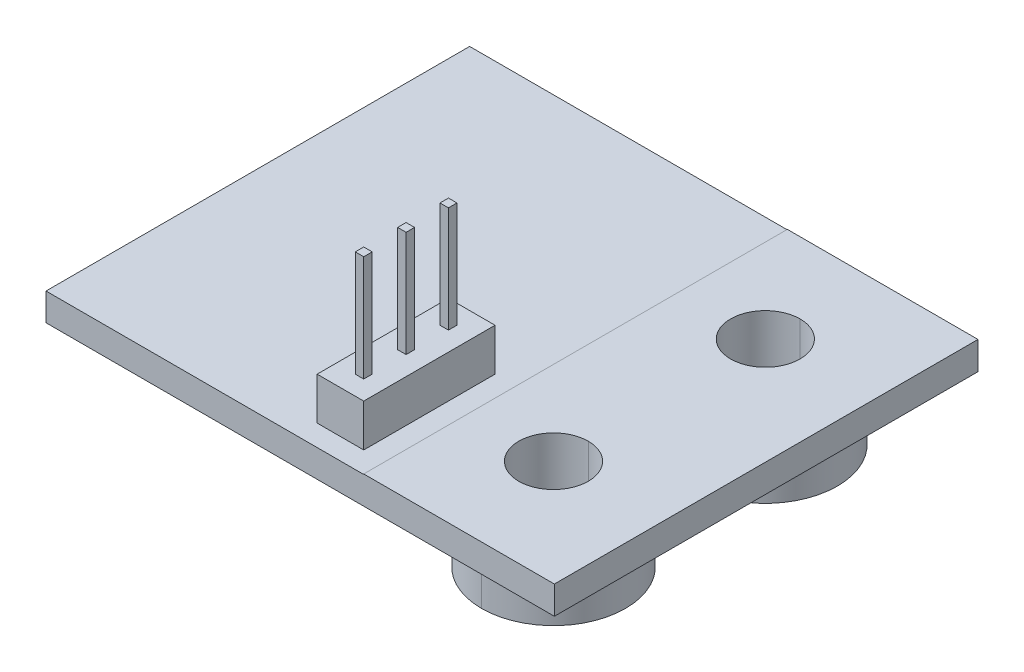
ISO-10303-21;
HEADER;
FILE_DESCRIPTION(('STEP AP214'),'2;1');
FILE_NAME('part.step','',(''),(''),'','','');
FILE_SCHEMA(('AUTOMOTIVE_DESIGN { 1 0 10303 214 1 1 1 1 }'));
ENDSEC;
DATA;
#1=APPLICATION_CONTEXT('core data for automotive mechanical design processes');
#2=APPLICATION_PROTOCOL_DEFINITION('international standard','automotive_design',2000,#1);
#3=PRODUCT_CONTEXT('',#1,'mechanical');
#4=PRODUCT('Part','Part','',(#3));
#5=PRODUCT_RELATED_PRODUCT_CATEGORY('part','',(#4));
#6=PRODUCT_DEFINITION_FORMATION('','',#4);
#7=PRODUCT_DEFINITION_CONTEXT('part definition',#1,'design');
#8=PRODUCT_DEFINITION('design','',#6,#7);
#9=PRODUCT_DEFINITION_SHAPE('','',#8);
#10=(LENGTH_UNIT() NAMED_UNIT(*) SI_UNIT(.MILLI.,.METRE.));
#11=(NAMED_UNIT(*) PLANE_ANGLE_UNIT() SI_UNIT($,.RADIAN.));
#12=(NAMED_UNIT(*) SI_UNIT($,.STERADIAN.) SOLID_ANGLE_UNIT());
#13=UNCERTAINTY_MEASURE_WITH_UNIT(LENGTH_MEASURE(1.E-05),#10,'distance_accuracy_value','');
#14=(GEOMETRIC_REPRESENTATION_CONTEXT(3) GLOBAL_UNCERTAINTY_ASSIGNED_CONTEXT((#13)) GLOBAL_UNIT_ASSIGNED_CONTEXT((#10,
#11,#12)) REPRESENTATION_CONTEXT('',''));
#15=CARTESIAN_POINT('',(0.,0.,0.));
#16=DIRECTION('',(0.,0.,1.));
#17=DIRECTION('',(1.,0.,0.));
#18=AXIS2_PLACEMENT_3D('',#15,#16,#17);
#19=CARTESIAN_POINT('',(8.8392,-4.6355,-6.35));
#20=DIRECTION('',(0.,1.,0.));
#21=DIRECTION('',(0.,0.,1.));
#22=AXIS2_PLACEMENT_3D('',#19,#20,#21);
#23=CYLINDRICAL_SURFACE('',#22,4.318);
#24=CARTESIAN_POINT('',(8.8392,-4.6355,-6.35));
#25=DIRECTION('',(0.,-1.,0.));
#26=DIRECTION('',(0.,0.,-1.));
#27=AXIS2_PLACEMENT_3D('',#24,#25,#26);
#28=CIRCLE('',#27,4.318);
#29=CARTESIAN_POINT('',(8.8392,-4.6355,-10.668));
#30=VERTEX_POINT('',#29);
#31=CARTESIAN_POINT('',(8.8392,-4.6355,-2.032));
#32=VERTEX_POINT('',#31);
#33=EDGE_CURVE('E41',#30,#32,#28,.T.);
#34=ORIENTED_EDGE('',*,*,#33,.F.);
#35=DIRECTION('',(0.,1.,0.));
#36=VECTOR('',#35,1.);
#37=CARTESIAN_POINT('',(8.8392,-4.6355,-10.668));
#38=LINE('',#37,#36);
#39=CARTESIAN_POINT('',(8.8392,-0.8255,-10.668));
#40=VERTEX_POINT('',#39);
#41=EDGE_CURVE('E10',#30,#40,#38,.T.);
#42=ORIENTED_EDGE('',*,*,#41,.T.);
#43=CARTESIAN_POINT('',(8.8392,-0.8255,-6.35));
#44=DIRECTION('',(0.,-1.,0.));
#45=DIRECTION('',(0.,0.,-1.));
#46=AXIS2_PLACEMENT_3D('',#43,#44,#45);
#47=CIRCLE('',#46,4.318);
#48=CARTESIAN_POINT('',(8.8392,-0.8255,-2.032));
#49=VERTEX_POINT('',#48);
#50=EDGE_CURVE('E30',#40,#49,#47,.T.);
#51=ORIENTED_EDGE('',*,*,#50,.T.);
#52=DIRECTION('',(0.,1.,0.));
#53=VECTOR('',#52,1.);
#54=CARTESIAN_POINT('',(8.8392,-4.6355,-2.032));
#55=LINE('',#54,#53);
#56=EDGE_CURVE('E388',#32,#49,#55,.T.);
#57=ORIENTED_EDGE('',*,*,#56,.F.);
#58=EDGE_LOOP('',(#34,#42,#51,#57));
#59=FACE_BOUND('',#58,.T.);
#60=ADVANCED_FACE('F16',(#59),#23,.T.);
#61=CARTESIAN_POINT('',(8.8392,-4.6355,6.35));
#62=DIRECTION('',(0.,1.,0.));
#63=DIRECTION('',(0.,0.,1.));
#64=AXIS2_PLACEMENT_3D('',#61,#62,#63);
#65=CYLINDRICAL_SURFACE('',#64,4.318);
#66=CARTESIAN_POINT('',(8.8392,-4.6355,6.35));
#67=DIRECTION('',(0.,-1.,0.));
#68=DIRECTION('',(0.,0.,-1.));
#69=AXIS2_PLACEMENT_3D('',#66,#67,#68);
#70=CIRCLE('',#69,4.318);
#71=CARTESIAN_POINT('',(8.8392,-4.6355,2.032));
#72=VERTEX_POINT('',#71);
#73=CARTESIAN_POINT('',(8.8392,-4.6355,10.668));
#74=VERTEX_POINT('',#73);
#75=EDGE_CURVE('E535',#72,#74,#70,.T.);
#76=ORIENTED_EDGE('',*,*,#75,.F.);
#77=DIRECTION('',(0.,1.,0.));
#78=VECTOR('',#77,1.);
#79=CARTESIAN_POINT('',(8.8392,-4.6355,2.032));
#80=LINE('',#79,#78);
#81=CARTESIAN_POINT('',(8.8392,-0.8255,2.032));
#82=VERTEX_POINT('',#81);
#83=EDGE_CURVE('E299',#72,#82,#80,.T.);
#84=ORIENTED_EDGE('',*,*,#83,.T.);
#85=CARTESIAN_POINT('',(8.8392,-0.8255,6.35));
#86=DIRECTION('',(0.,-1.,0.));
#87=DIRECTION('',(0.,0.,-1.));
#88=AXIS2_PLACEMENT_3D('',#85,#86,#87);
#89=CIRCLE('',#88,4.318);
#90=CARTESIAN_POINT('',(8.8392,-0.8255,10.668));
#91=VERTEX_POINT('',#90);
#92=EDGE_CURVE('E444',#82,#91,#89,.T.);
#93=ORIENTED_EDGE('',*,*,#92,.T.);
#94=DIRECTION('',(0.,1.,0.));
#95=VECTOR('',#94,1.);
#96=CARTESIAN_POINT('',(8.8392,-4.6355,10.668));
#97=LINE('',#96,#95);
#98=EDGE_CURVE('E476',#74,#91,#97,.T.);
#99=ORIENTED_EDGE('',*,*,#98,.F.);
#100=EDGE_LOOP('',(#76,#84,#93,#99));
#101=FACE_BOUND('',#100,.T.);
#102=ADVANCED_FACE('F663',(#101),#65,.T.);
#103=CARTESIAN_POINT('',(8.8392,0.8255,6.35));
#104=DIRECTION('',(0.,-1.,0.));
#105=DIRECTION('',(0.,0.,-1.));
#106=AXIS2_PLACEMENT_3D('',#103,#104,#105);
#107=CYLINDRICAL_SURFACE('',#106,2.0828);
#108=CARTESIAN_POINT('',(8.8392,0.8509,6.35));
#109=DIRECTION('',(0.,1.,0.));
#110=DIRECTION('',(0.,0.,1.));
#111=AXIS2_PLACEMENT_3D('',#108,#109,#110);
#112=CIRCLE('',#111,2.0828);
#113=CARTESIAN_POINT('',(8.8392,0.8509,4.2672));
#114=VERTEX_POINT('',#113);
#115=CARTESIAN_POINT('',(8.8392,0.8509,8.4328));
#116=VERTEX_POINT('',#115);
#117=EDGE_CURVE('E451',#114,#116,#112,.T.);
#118=ORIENTED_EDGE('',*,*,#117,.T.);
#119=DIRECTION('',(0.,-1.,0.));
#120=VECTOR('',#119,1.);
#121=CARTESIAN_POINT('',(8.8392,0.8255,8.4328));
#122=LINE('',#121,#120);
#123=CARTESIAN_POINT('',(8.8392,-4.6355,8.4328));
#124=VERTEX_POINT('',#123);
#125=EDGE_CURVE('E447',#116,#124,#122,.T.);
#126=ORIENTED_EDGE('',*,*,#125,.T.);
#127=CARTESIAN_POINT('',(8.8392,-4.6355,6.35));
#128=DIRECTION('',(0.,-1.,0.));
#129=DIRECTION('',(0.,0.,-1.));
#130=AXIS2_PLACEMENT_3D('',#127,#128,#129);
#131=CIRCLE('',#130,2.0828);
#132=CARTESIAN_POINT('',(8.8392,-4.6355,4.2672));
#133=VERTEX_POINT('',#132);
#134=EDGE_CURVE('E308',#124,#133,#131,.T.);
#135=ORIENTED_EDGE('',*,*,#134,.T.);
#136=DIRECTION('',(0.,-1.,0.));
#137=VECTOR('',#136,1.);
#138=CARTESIAN_POINT('',(8.8392,0.8255,4.2672));
#139=LINE('',#138,#137);
#140=EDGE_CURVE('E359',#114,#133,#139,.T.);
#141=ORIENTED_EDGE('',*,*,#140,.F.);
#142=EDGE_LOOP('',(#118,#126,#135,#141));
#143=FACE_BOUND('',#142,.T.);
#144=ADVANCED_FACE('F648',(#143),#107,.F.);
#145=CARTESIAN_POINT('',(8.8392,0.8255,-6.35));
#146=DIRECTION('',(0.,-1.,0.));
#147=DIRECTION('',(0.,0.,-1.));
#148=AXIS2_PLACEMENT_3D('',#145,#146,#147);
#149=CYLINDRICAL_SURFACE('',#148,2.0828);
#150=CARTESIAN_POINT('',(8.8392,0.8509,-6.35));
#151=DIRECTION('',(0.,1.,0.));
#152=DIRECTION('',(0.,0.,1.));
#153=AXIS2_PLACEMENT_3D('',#150,#151,#152);
#154=CIRCLE('',#153,2.0828);
#155=CARTESIAN_POINT('',(8.8392,0.8509,-8.4328));
#156=VERTEX_POINT('',#155);
#157=CARTESIAN_POINT('',(8.8392,0.8509,-4.2672));
#158=VERTEX_POINT('',#157);
#159=EDGE_CURVE('E305',#156,#158,#154,.T.);
#160=ORIENTED_EDGE('',*,*,#159,.T.);
#161=DIRECTION('',(0.,-1.,0.));
#162=VECTOR('',#161,1.);
#163=CARTESIAN_POINT('',(8.8392,0.8255,-4.2672));
#164=LINE('',#163,#162);
#165=CARTESIAN_POINT('',(8.8392,-4.6355,-4.2672));
#166=VERTEX_POINT('',#165);
#167=EDGE_CURVE('E307',#158,#166,#164,.T.);
#168=ORIENTED_EDGE('',*,*,#167,.T.);
#169=CARTESIAN_POINT('',(8.8392,-4.6355,-6.35));
#170=DIRECTION('',(0.,-1.,0.));
#171=DIRECTION('',(0.,0.,-1.));
#172=AXIS2_PLACEMENT_3D('',#169,#170,#171);
#173=CIRCLE('',#172,2.0828);
#174=CARTESIAN_POINT('',(8.8392,-4.6355,-8.4328));
#175=VERTEX_POINT('',#174);
#176=EDGE_CURVE('E366',#166,#175,#173,.T.);
#177=ORIENTED_EDGE('',*,*,#176,.T.);
#178=DIRECTION('',(0.,-1.,0.));
#179=VECTOR('',#178,1.);
#180=CARTESIAN_POINT('',(8.8392,0.8255,-8.4328));
#181=LINE('',#180,#179);
#182=EDGE_CURVE('E354',#156,#175,#181,.T.);
#183=ORIENTED_EDGE('',*,*,#182,.F.);
#184=EDGE_LOOP('',(#160,#168,#177,#183));
#185=FACE_BOUND('',#184,.T.);
#186=ADVANCED_FACE('F634',(#185),#149,.F.);
#187=CARTESIAN_POINT('',(15.24,0.8255,-12.7));
#188=DIRECTION('',(0.,-1.,0.));
#189=DIRECTION('',(0.,0.,-1.));
#190=AXIS2_PLACEMENT_3D('',#187,#188,#189);
#191=PLANE('',#190);
#192=DIRECTION('',(0.,0.,1.));
#193=VECTOR('',#192,1.);
#194=CARTESIAN_POINT('',(3.81,0.8255,-12.7));
#195=LINE('',#194,#193);
#196=CARTESIAN_POINT('',(3.81,0.8255,-12.7));
#197=VERTEX_POINT('',#196);
#198=CARTESIAN_POINT('',(3.81,0.8255,12.7));
#199=VERTEX_POINT('',#198);
#200=EDGE_CURVE('E247',#197,#199,#195,.T.);
#201=ORIENTED_EDGE('',*,*,#200,.F.);
#202=DIRECTION('',(-1.,0.,0.));
#203=VECTOR('',#202,1.);
#204=CARTESIAN_POINT('',(-15.24,0.8255,-12.7));
#205=LINE('',#204,#203);
#206=CARTESIAN_POINT('',(-15.24,0.8255,-12.7));
#207=VERTEX_POINT('',#206);
#208=EDGE_CURVE('E244',#197,#207,#205,.T.);
#209=ORIENTED_EDGE('',*,*,#208,.T.);
#210=DIRECTION('',(0.,0.,1.));
#211=VECTOR('',#210,1.);
#212=CARTESIAN_POINT('',(-15.24,0.8255,12.7));
#213=LINE('',#212,#211);
#214=CARTESIAN_POINT('',(-15.24,0.8255,12.7));
#215=VERTEX_POINT('',#214);
#216=EDGE_CURVE('E406',#207,#215,#213,.T.);
#217=ORIENTED_EDGE('',*,*,#216,.T.);
#218=DIRECTION('',(1.,0.,0.));
#219=VECTOR('',#218,1.);
#220=CARTESIAN_POINT('',(-15.24,0.8255,12.7));
#221=LINE('',#220,#219);
#222=EDGE_CURVE('E409',#215,#199,#221,.T.);
#223=ORIENTED_EDGE('',*,*,#222,.T.);
#224=EDGE_LOOP('',(#201,#209,#217,#223));
#225=FACE_BOUND('',#224,.T.);
#226=DIRECTION('',(0.,0.,1.));
#227=VECTOR('',#226,1.);
#228=CARTESIAN_POINT('',(-0.254,0.8255,3.556));
#229=LINE('',#228,#227);
#230=CARTESIAN_POINT('',(-0.254,0.8255,3.556));
#231=VERTEX_POINT('',#230);
#232=CARTESIAN_POINT('',(-0.254,0.8255,11.43));
#233=VERTEX_POINT('',#232);
#234=EDGE_CURVE('E322',#231,#233,#229,.T.);
#235=ORIENTED_EDGE('',*,*,#234,.F.);
#236=DIRECTION('',(-1.,0.,0.));
#237=VECTOR('',#236,1.);
#238=CARTESIAN_POINT('',(-0.254,0.8255,3.556));
#239=LINE('',#238,#237);
#240=CARTESIAN_POINT('',(2.54,0.8255,3.556));
#241=VERTEX_POINT('',#240);
#242=EDGE_CURVE('E568',#241,#231,#239,.T.);
#243=ORIENTED_EDGE('',*,*,#242,.F.);
#244=DIRECTION('',(0.,0.,-1.));
#245=VECTOR('',#244,1.);
#246=CARTESIAN_POINT('',(2.54,0.8255,3.556));
#247=LINE('',#246,#245);
#248=CARTESIAN_POINT('',(2.54,0.8255,11.43));
#249=VERTEX_POINT('',#248);
#250=EDGE_CURVE('E482',#249,#241,#247,.T.);
#251=ORIENTED_EDGE('',*,*,#250,.F.);
#252=DIRECTION('',(1.,0.,0.));
#253=VECTOR('',#252,1.);
#254=CARTESIAN_POINT('',(-0.254,0.8255,11.43));
#255=LINE('',#254,#253);
#256=EDGE_CURVE('E324',#233,#249,#255,.T.);
#257=ORIENTED_EDGE('',*,*,#256,.F.);
#258=EDGE_LOOP('',(#235,#243,#251,#257));
#259=FACE_BOUND('',#258,.T.);
#260=ADVANCED_FACE('F605',(#225,#259),#191,.F.);
#261=CARTESIAN_POINT('',(-0.254,3.3655,11.43));
#262=DIRECTION('',(0.,1.,0.));
#263=DIRECTION('',(1.,0.,0.));
#264=AXIS2_PLACEMENT_3D('',#261,#262,#263);
#265=PLANE('',#264);
#266=DIRECTION('',(0.,0.,1.));
#267=VECTOR('',#266,1.);
#268=CARTESIAN_POINT('',(-0.254,3.3655,3.556));
#269=LINE('',#268,#267);
#270=CARTESIAN_POINT('',(-0.254,3.3655,3.556));
#271=VERTEX_POINT('',#270);
#272=CARTESIAN_POINT('',(-0.254,3.3655,11.43));
#273=VERTEX_POINT('',#272);
#274=EDGE_CURVE('E429',#271,#273,#269,.T.);
#275=ORIENTED_EDGE('',*,*,#274,.T.);
#276=DIRECTION('',(1.,0.,0.));
#277=VECTOR('',#276,1.);
#278=CARTESIAN_POINT('',(-0.254,3.3655,11.43));
#279=LINE('',#278,#277);
#280=CARTESIAN_POINT('',(2.54,3.3655,11.43));
#281=VERTEX_POINT('',#280);
#282=EDGE_CURVE('E417',#273,#281,#279,.T.);
#283=ORIENTED_EDGE('',*,*,#282,.T.);
#284=DIRECTION('',(0.,0.,-1.));
#285=VECTOR('',#284,1.);
#286=CARTESIAN_POINT('',(2.54,3.3655,3.556));
#287=LINE('',#286,#285);
#288=CARTESIAN_POINT('',(2.54,3.3655,3.556));
#289=VERTEX_POINT('',#288);
#290=EDGE_CURVE('E412',#281,#289,#287,.T.);
#291=ORIENTED_EDGE('',*,*,#290,.T.);
#292=DIRECTION('',(-1.,0.,0.));
#293=VECTOR('',#292,1.);
#294=CARTESIAN_POINT('',(-0.254,3.3655,3.556));
#295=LINE('',#294,#293);
#296=EDGE_CURVE('E405',#289,#271,#295,.T.);
#297=ORIENTED_EDGE('',*,*,#296,.T.);
#298=EDGE_LOOP('',(#275,#283,#291,#297));
#299=FACE_BOUND('',#298,.T.);
#300=DIRECTION('',(-1.,0.,0.));
#301=VECTOR('',#300,1.);
#302=CARTESIAN_POINT('',(0.889,3.3655,9.779));
#303=LINE('',#302,#301);
#304=CARTESIAN_POINT('',(1.397,3.3655,9.779));
#305=VERTEX_POINT('',#304);
#306=CARTESIAN_POINT('',(0.889,3.3655,9.779));
#307=VERTEX_POINT('',#306);
#308=EDGE_CURVE('E333',#305,#307,#303,.T.);
#309=ORIENTED_EDGE('',*,*,#308,.F.);
#310=DIRECTION('',(0.,0.,-1.));
#311=VECTOR('',#310,1.);
#312=CARTESIAN_POINT('',(1.397,3.3655,10.287));
#313=LINE('',#312,#311);
#314=CARTESIAN_POINT('',(1.397,3.3655,10.287));
#315=VERTEX_POINT('',#314);
#316=EDGE_CURVE('E454',#315,#305,#313,.T.);
#317=ORIENTED_EDGE('',*,*,#316,.F.);
#318=DIRECTION('',(1.,0.,0.));
#319=VECTOR('',#318,1.);
#320=CARTESIAN_POINT('',(0.889,3.3655,10.287));
#321=LINE('',#320,#319);
#322=CARTESIAN_POINT('',(0.889,3.3655,10.287));
#323=VERTEX_POINT('',#322);
#324=EDGE_CURVE('E344',#323,#315,#321,.T.);
#325=ORIENTED_EDGE('',*,*,#324,.F.);
#326=DIRECTION('',(0.,0.,1.));
#327=VECTOR('',#326,1.);
#328=CARTESIAN_POINT('',(0.889,3.3655,10.287));
#329=LINE('',#328,#327);
#330=EDGE_CURVE('E375',#307,#323,#329,.T.);
#331=ORIENTED_EDGE('',*,*,#330,.F.);
#332=EDGE_LOOP('',(#309,#317,#325,#331));
#333=FACE_BOUND('',#332,.T.);
#334=DIRECTION('',(-1.,0.,0.));
#335=VECTOR('',#334,1.);
#336=CARTESIAN_POINT('',(0.889,3.3655,7.239));
#337=LINE('',#336,#335);
#338=CARTESIAN_POINT('',(1.397,3.3655,7.239));
#339=VERTEX_POINT('',#338);
#340=CARTESIAN_POINT('',(0.889,3.3655,7.239));
#341=VERTEX_POINT('',#340);
#342=EDGE_CURVE('E496',#339,#341,#337,.T.);
#343=ORIENTED_EDGE('',*,*,#342,.F.);
#344=DIRECTION('',(0.,0.,-1.));
#345=VECTOR('',#344,1.);
#346=CARTESIAN_POINT('',(1.397,3.3655,7.747));
#347=LINE('',#346,#345);
#348=CARTESIAN_POINT('',(1.397,3.3655,7.747));
#349=VERTEX_POINT('',#348);
#350=EDGE_CURVE('E291',#349,#339,#347,.T.);
#351=ORIENTED_EDGE('',*,*,#350,.F.);
#352=DIRECTION('',(1.,0.,0.));
#353=VECTOR('',#352,1.);
#354=CARTESIAN_POINT('',(0.889,3.3655,7.747));
#355=LINE('',#354,#353);
#356=CARTESIAN_POINT('',(0.889,3.3655,7.747));
#357=VERTEX_POINT('',#356);
#358=EDGE_CURVE('E20',#357,#349,#355,.T.);
#359=ORIENTED_EDGE('',*,*,#358,.F.);
#360=DIRECTION('',(0.,0.,1.));
#361=VECTOR('',#360,1.);
#362=CARTESIAN_POINT('',(0.889,3.3655,7.747));
#363=LINE('',#362,#361);
#364=EDGE_CURVE('E285',#341,#357,#363,.T.);
#365=ORIENTED_EDGE('',*,*,#364,.F.);
#366=EDGE_LOOP('',(#343,#351,#359,#365));
#367=FACE_BOUND('',#366,.T.);
#368=DIRECTION('',(-1.,0.,0.));
#369=VECTOR('',#368,1.);
#370=CARTESIAN_POINT('',(0.889,3.3655,4.699));
#371=LINE('',#370,#369);
#372=CARTESIAN_POINT('',(1.397,3.3655,4.699));
#373=VERTEX_POINT('',#372);
#374=CARTESIAN_POINT('',(0.889,3.3655,4.699));
#375=VERTEX_POINT('',#374);
#376=EDGE_CURVE('E329',#373,#375,#371,.T.);
#377=ORIENTED_EDGE('',*,*,#376,.F.);
#378=DIRECTION('',(0.,0.,-1.));
#379=VECTOR('',#378,1.);
#380=CARTESIAN_POINT('',(1.397,3.3655,5.207));
#381=LINE('',#380,#379);
#382=CARTESIAN_POINT('',(1.397,3.3655,5.207));
#383=VERTEX_POINT('',#382);
#384=EDGE_CURVE('E317',#383,#373,#381,.T.);
#385=ORIENTED_EDGE('',*,*,#384,.F.);
#386=DIRECTION('',(1.,0.,0.));
#387=VECTOR('',#386,1.);
#388=CARTESIAN_POINT('',(0.889,3.3655,5.207));
#389=LINE('',#388,#387);
#390=CARTESIAN_POINT('',(0.889,3.3655,5.207));
#391=VERTEX_POINT('',#390);
#392=EDGE_CURVE('E289',#391,#383,#389,.T.);
#393=ORIENTED_EDGE('',*,*,#392,.F.);
#394=DIRECTION('',(0.,0.,1.));
#395=VECTOR('',#394,1.);
#396=CARTESIAN_POINT('',(0.889,3.3655,5.207));
#397=LINE('',#396,#395);
#398=EDGE_CURVE('E346',#375,#391,#397,.T.);
#399=ORIENTED_EDGE('',*,*,#398,.F.);
#400=EDGE_LOOP('',(#377,#385,#393,#399));
#401=FACE_BOUND('',#400,.T.);
#402=ADVANCED_FACE('F697',(#299,#333,#367,#401),#265,.T.);
#403=CARTESIAN_POINT('',(15.24,-0.8255,-12.7));
#404=DIRECTION('',(0.,-1.,0.));
#405=DIRECTION('',(0.,0.,-1.));
#406=AXIS2_PLACEMENT_3D('',#403,#404,#405);
#407=PLANE('',#406);
#408=DIRECTION('',(0.,0.,-1.));
#409=VECTOR('',#408,1.);
#410=CARTESIAN_POINT('',(15.24,-0.8255,12.7));
#411=LINE('',#410,#409);
#412=CARTESIAN_POINT('',(15.24,-0.8255,12.7));
#413=VERTEX_POINT('',#412);
#414=CARTESIAN_POINT('',(15.24,-0.8255,-12.7));
#415=VERTEX_POINT('',#414);
#416=EDGE_CURVE('E400',#413,#415,#411,.T.);
#417=ORIENTED_EDGE('',*,*,#416,.F.);
#418=DIRECTION('',(1.,0.,0.));
#419=VECTOR('',#418,1.);
#420=CARTESIAN_POINT('',(-15.24,-0.8255,12.7));
#421=LINE('',#420,#419);
#422=CARTESIAN_POINT('',(-15.24,-0.8255,12.7));
#423=VERTEX_POINT('',#422);
#424=EDGE_CURVE('E466',#423,#413,#421,.T.);
#425=ORIENTED_EDGE('',*,*,#424,.F.);
#426=DIRECTION('',(0.,0.,1.));
#427=VECTOR('',#426,1.);
#428=CARTESIAN_POINT('',(-15.24,-0.8255,12.7));
#429=LINE('',#428,#427);
#430=CARTESIAN_POINT('',(-15.24,-0.8255,-12.7));
#431=VERTEX_POINT('',#430);
#432=EDGE_CURVE('E434',#431,#423,#429,.T.);
#433=ORIENTED_EDGE('',*,*,#432,.F.);
#434=DIRECTION('',(-1.,0.,0.));
#435=VECTOR('',#434,1.);
#436=CARTESIAN_POINT('',(-15.24,-0.8255,-12.7));
#437=LINE('',#436,#435);
#438=EDGE_CURVE('E431',#415,#431,#437,.T.);
#439=ORIENTED_EDGE('',*,*,#438,.F.);
#440=EDGE_LOOP('',(#417,#425,#433,#439));
#441=FACE_BOUND('',#440,.T.);
#442=CARTESIAN_POINT('',(8.8392,-0.8255,6.35));
#443=DIRECTION('',(0.,-1.,0.));
#444=DIRECTION('',(0.,0.,-1.));
#445=AXIS2_PLACEMENT_3D('',#442,#443,#444);
#446=CIRCLE('',#445,4.318);
#447=EDGE_CURVE('E475',#91,#82,#446,.T.);
#448=ORIENTED_EDGE('',*,*,#447,.F.);
#449=ORIENTED_EDGE('',*,*,#92,.F.);
#450=EDGE_LOOP('',(#448,#449));
#451=FACE_BOUND('',#450,.T.);
#452=CARTESIAN_POINT('',(8.8392,-0.8255,-6.35));
#453=DIRECTION('',(0.,-1.,0.));
#454=DIRECTION('',(0.,0.,-1.));
#455=AXIS2_PLACEMENT_3D('',#452,#453,#454);
#456=CIRCLE('',#455,4.318);
#457=EDGE_CURVE('E394',#49,#40,#456,.T.);
#458=ORIENTED_EDGE('',*,*,#457,.F.);
#459=ORIENTED_EDGE('',*,*,#50,.F.);
#460=EDGE_LOOP('',(#458,#459));
#461=FACE_BOUND('',#460,.T.);
#462=ADVANCED_FACE('F584',(#441,#451,#461),#407,.T.);
#463=CARTESIAN_POINT('',(15.24,0.8255,12.7));
#464=DIRECTION('',(-1.,0.,0.));
#465=DIRECTION('',(0.,0.,1.));
#466=AXIS2_PLACEMENT_3D('',#463,#464,#465);
#467=PLANE('',#466);
#468=ORIENTED_EDGE('',*,*,#416,.T.);
#469=DIRECTION('',(0.,-1.,0.));
#470=VECTOR('',#469,1.);
#471=CARTESIAN_POINT('',(15.24,0.8255,-12.7));
#472=LINE('',#471,#470);
#473=CARTESIAN_POINT('',(15.24,0.8509,-12.7));
#474=VERTEX_POINT('',#473);
#475=EDGE_CURVE('E432',#474,#415,#472,.T.);
#476=ORIENTED_EDGE('',*,*,#475,.F.);
#477=DIRECTION('',(0.,0.,-1.));
#478=VECTOR('',#477,1.);
#479=CARTESIAN_POINT('',(15.24,0.8509,-12.7));
#480=LINE('',#479,#478);
#481=CARTESIAN_POINT('',(15.24,0.8509,12.7));
#482=VERTEX_POINT('',#481);
#483=EDGE_CURVE('E260',#482,#474,#480,.T.);
#484=ORIENTED_EDGE('',*,*,#483,.F.);
#485=DIRECTION('',(0.,-1.,0.));
#486=VECTOR('',#485,1.);
#487=CARTESIAN_POINT('',(15.24,0.8255,12.7));
#488=LINE('',#487,#486);
#489=EDGE_CURVE('E401',#482,#413,#488,.T.);
#490=ORIENTED_EDGE('',*,*,#489,.T.);
#491=EDGE_LOOP('',(#468,#476,#484,#490));
#492=FACE_BOUND('',#491,.T.);
#493=ADVANCED_FACE('F583',(#492),#467,.F.);
#494=CARTESIAN_POINT('',(-15.24,0.8255,-12.7));
#495=DIRECTION('',(0.,0.,1.));
#496=DIRECTION('',(1.,0.,0.));
#497=AXIS2_PLACEMENT_3D('',#494,#495,#496);
#498=PLANE('',#497);
#499=ORIENTED_EDGE('',*,*,#438,.T.);
#500=DIRECTION('',(0.,-1.,0.));
#501=VECTOR('',#500,1.);
#502=CARTESIAN_POINT('',(-15.24,0.8255,-12.7));
#503=LINE('',#502,#501);
#504=EDGE_CURVE('E438',#207,#431,#503,.T.);
#505=ORIENTED_EDGE('',*,*,#504,.F.);
#506=ORIENTED_EDGE('',*,*,#208,.F.);
#507=DIRECTION('',(0.,-1.,0.));
#508=VECTOR('',#507,1.);
#509=CARTESIAN_POINT('',(3.81,0.8509,-12.7));
#510=LINE('',#509,#508);
#511=CARTESIAN_POINT('',(3.81,0.8509,-12.7));
#512=VERTEX_POINT('',#511);
#513=EDGE_CURVE('E240',#512,#197,#510,.T.);
#514=ORIENTED_EDGE('',*,*,#513,.F.);
#515=DIRECTION('',(-1.,0.,0.));
#516=VECTOR('',#515,1.);
#517=CARTESIAN_POINT('',(3.81,0.8509,-12.7));
#518=LINE('',#517,#516);
#519=EDGE_CURVE('E241',#474,#512,#518,.T.);
#520=ORIENTED_EDGE('',*,*,#519,.F.);
#521=ORIENTED_EDGE('',*,*,#475,.T.);
#522=EDGE_LOOP('',(#499,#505,#506,#514,#520,#521));
#523=FACE_BOUND('',#522,.T.);
#524=ADVANCED_FACE('F237',(#523),#498,.F.);
#525=CARTESIAN_POINT('',(-15.24,0.8255,12.7));
#526=DIRECTION('',(1.,0.,0.));
#527=DIRECTION('',(0.,1.,0.));
#528=AXIS2_PLACEMENT_3D('',#525,#526,#527);
#529=PLANE('',#528);
#530=ORIENTED_EDGE('',*,*,#432,.T.);
#531=DIRECTION('',(0.,-1.,0.));
#532=VECTOR('',#531,1.);
#533=CARTESIAN_POINT('',(-15.24,0.8255,12.7));
#534=LINE('',#533,#532);
#535=EDGE_CURVE('E470',#215,#423,#534,.T.);
#536=ORIENTED_EDGE('',*,*,#535,.F.);
#537=ORIENTED_EDGE('',*,*,#216,.F.);
#538=ORIENTED_EDGE('',*,*,#504,.T.);
#539=EDGE_LOOP('',(#530,#536,#537,#538));
#540=FACE_BOUND('',#539,.T.);
#541=ADVANCED_FACE('F595',(#540),#529,.F.);
#542=CARTESIAN_POINT('',(-15.24,0.8255,12.7));
#543=DIRECTION('',(0.,0.,-1.));
#544=DIRECTION('',(0.,-1.,0.));
#545=AXIS2_PLACEMENT_3D('',#542,#543,#544);
#546=PLANE('',#545);
#547=ORIENTED_EDGE('',*,*,#424,.T.);
#548=ORIENTED_EDGE('',*,*,#489,.F.);
#549=DIRECTION('',(1.,0.,0.));
#550=VECTOR('',#549,1.);
#551=CARTESIAN_POINT('',(3.81,0.8509,12.7));
#552=LINE('',#551,#550);
#553=CARTESIAN_POINT('',(3.81,0.8509,12.7));
#554=VERTEX_POINT('',#553);
#555=EDGE_CURVE('E270',#554,#482,#552,.T.);
#556=ORIENTED_EDGE('',*,*,#555,.F.);
#557=DIRECTION('',(0.,-1.,0.));
#558=VECTOR('',#557,1.);
#559=CARTESIAN_POINT('',(3.81,0.8509,12.7));
#560=LINE('',#559,#558);
#561=EDGE_CURVE('E262',#554,#199,#560,.T.);
#562=ORIENTED_EDGE('',*,*,#561,.T.);
#563=ORIENTED_EDGE('',*,*,#222,.F.);
#564=ORIENTED_EDGE('',*,*,#535,.T.);
#565=EDGE_LOOP('',(#547,#548,#556,#562,#563,#564));
#566=FACE_BOUND('',#565,.T.);
#567=ADVANCED_FACE('F596',(#566),#546,.F.);
#568=CARTESIAN_POINT('',(8.8392,0.8255,-6.35));
#569=DIRECTION('',(0.,-1.,0.));
#570=DIRECTION('',(0.,0.,-1.));
#571=AXIS2_PLACEMENT_3D('',#568,#569,#570);
#572=CYLINDRICAL_SURFACE('',#571,2.0828);
#573=ORIENTED_EDGE('',*,*,#167,.F.);
#574=CARTESIAN_POINT('',(8.8392,0.8509,-6.35));
#575=DIRECTION('',(0.,1.,0.));
#576=DIRECTION('',(0.,0.,1.));
#577=AXIS2_PLACEMENT_3D('',#574,#575,#576);
#578=CIRCLE('',#577,2.0828);
#579=EDGE_CURVE('E358',#158,#156,#578,.T.);
#580=ORIENTED_EDGE('',*,*,#579,.T.);
#581=ORIENTED_EDGE('',*,*,#182,.T.);
#582=CARTESIAN_POINT('',(8.8392,-4.6355,-6.35));
#583=DIRECTION('',(0.,-1.,0.));
#584=DIRECTION('',(0.,0.,-1.));
#585=AXIS2_PLACEMENT_3D('',#582,#583,#584);
#586=CIRCLE('',#585,2.0828);
#587=EDGE_CURVE('E357',#175,#166,#586,.T.);
#588=ORIENTED_EDGE('',*,*,#587,.T.);
#589=EDGE_LOOP('',(#573,#580,#581,#588));
#590=FACE_BOUND('',#589,.T.);
#591=ADVANCED_FACE('F640',(#590),#572,.F.);
#592=CARTESIAN_POINT('',(8.8392,0.8255,6.35));
#593=DIRECTION('',(0.,-1.,0.));
#594=DIRECTION('',(0.,0.,-1.));
#595=AXIS2_PLACEMENT_3D('',#592,#593,#594);
#596=CYLINDRICAL_SURFACE('',#595,2.0828);
#597=ORIENTED_EDGE('',*,*,#125,.F.);
#598=CARTESIAN_POINT('',(8.8392,0.8509,6.35));
#599=DIRECTION('',(0.,1.,0.));
#600=DIRECTION('',(0.,0.,1.));
#601=AXIS2_PLACEMENT_3D('',#598,#599,#600);
#602=CIRCLE('',#601,2.0828);
#603=EDGE_CURVE('E361',#116,#114,#602,.T.);
#604=ORIENTED_EDGE('',*,*,#603,.T.);
#605=ORIENTED_EDGE('',*,*,#140,.T.);
#606=CARTESIAN_POINT('',(8.8392,-4.6355,6.35));
#607=DIRECTION('',(0.,-1.,0.));
#608=DIRECTION('',(0.,0.,-1.));
#609=AXIS2_PLACEMENT_3D('',#606,#607,#608);
#610=CIRCLE('',#609,2.0828);
#611=EDGE_CURVE('E365',#133,#124,#610,.T.);
#612=ORIENTED_EDGE('',*,*,#611,.T.);
#613=EDGE_LOOP('',(#597,#604,#605,#612));
#614=FACE_BOUND('',#613,.T.);
#615=ADVANCED_FACE('F650',(#614),#596,.F.);
#616=CARTESIAN_POINT('',(8.8392,-4.6355,6.35));
#617=DIRECTION('',(0.,-1.,0.));
#618=DIRECTION('',(0.,0.,-1.));
#619=AXIS2_PLACEMENT_3D('',#616,#617,#618);
#620=PLANE('',#619);
#621=CARTESIAN_POINT('',(8.8392,-4.6355,6.35));
#622=DIRECTION('',(0.,-1.,0.));
#623=DIRECTION('',(0.,0.,-1.));
#624=AXIS2_PLACEMENT_3D('',#621,#622,#623);
#625=CIRCLE('',#624,4.318);
#626=EDGE_CURVE('E522',#74,#72,#625,.T.);
#627=ORIENTED_EDGE('',*,*,#626,.T.);
#628=ORIENTED_EDGE('',*,*,#75,.T.);
#629=EDGE_LOOP('',(#627,#628));
#630=FACE_BOUND('',#629,.T.);
#631=ORIENTED_EDGE('',*,*,#611,.F.);
#632=ORIENTED_EDGE('',*,*,#134,.F.);
#633=EDGE_LOOP('',(#631,#632));
#634=FACE_BOUND('',#633,.T.);
#635=ADVANCED_FACE('F649',(#630,#634),#620,.T.);
#636=CARTESIAN_POINT('',(8.8392,-4.6355,6.35));
#637=DIRECTION('',(0.,1.,0.));
#638=DIRECTION('',(0.,0.,1.));
#639=AXIS2_PLACEMENT_3D('',#636,#637,#638);
#640=CYLINDRICAL_SURFACE('',#639,4.318);
#641=ORIENTED_EDGE('',*,*,#83,.F.);
#642=ORIENTED_EDGE('',*,*,#626,.F.);
#643=ORIENTED_EDGE('',*,*,#98,.T.);
#644=ORIENTED_EDGE('',*,*,#447,.T.);
#645=EDGE_LOOP('',(#641,#642,#643,#644));
#646=FACE_BOUND('',#645,.T.);
#647=ADVANCED_FACE('F655',(#646),#640,.T.);
#648=CARTESIAN_POINT('',(8.8392,-4.6355,-6.35));
#649=DIRECTION('',(0.,-1.,0.));
#650=DIRECTION('',(0.,0.,-1.));
#651=AXIS2_PLACEMENT_3D('',#648,#649,#650);
#652=PLANE('',#651);
#653=CARTESIAN_POINT('',(8.8392,-4.6355,-6.35));
#654=DIRECTION('',(0.,-1.,0.));
#655=DIRECTION('',(0.,0.,-1.));
#656=AXIS2_PLACEMENT_3D('',#653,#654,#655);
#657=CIRCLE('',#656,4.318);
#658=EDGE_CURVE('E469',#32,#30,#657,.T.);
#659=ORIENTED_EDGE('',*,*,#658,.T.);
#660=ORIENTED_EDGE('',*,*,#33,.T.);
#661=EDGE_LOOP('',(#659,#660));
#662=FACE_BOUND('',#661,.T.);
#663=ORIENTED_EDGE('',*,*,#587,.F.);
#664=ORIENTED_EDGE('',*,*,#176,.F.);
#665=EDGE_LOOP('',(#663,#664));
#666=FACE_BOUND('',#665,.T.);
#667=ADVANCED_FACE('F633',(#662,#666),#652,.T.);
#668=CARTESIAN_POINT('',(8.8392,-4.6355,-6.35));
#669=DIRECTION('',(0.,1.,0.));
#670=DIRECTION('',(0.,0.,1.));
#671=AXIS2_PLACEMENT_3D('',#668,#669,#670);
#672=CYLINDRICAL_SURFACE('',#671,4.318);
#673=ORIENTED_EDGE('',*,*,#41,.F.);
#674=ORIENTED_EDGE('',*,*,#658,.F.);
#675=ORIENTED_EDGE('',*,*,#56,.T.);
#676=ORIENTED_EDGE('',*,*,#457,.T.);
#677=EDGE_LOOP('',(#673,#674,#675,#676));
#678=FACE_BOUND('',#677,.T.);
#679=ADVANCED_FACE('F689',(#678),#672,.T.);
#680=CARTESIAN_POINT('',(-0.254,3.3655,3.556));
#681=DIRECTION('',(1.,0.,0.));
#682=DIRECTION('',(0.,1.,0.));
#683=AXIS2_PLACEMENT_3D('',#680,#681,#682);
#684=PLANE('',#683);
#685=ORIENTED_EDGE('',*,*,#234,.T.);
#686=DIRECTION('',(0.,-1.,0.));
#687=VECTOR('',#686,1.);
#688=CARTESIAN_POINT('',(-0.254,3.3655,11.43));
#689=LINE('',#688,#687);
#690=EDGE_CURVE('E331',#273,#233,#689,.T.);
#691=ORIENTED_EDGE('',*,*,#690,.F.);
#692=ORIENTED_EDGE('',*,*,#274,.F.);
#693=DIRECTION('',(0.,-1.,0.));
#694=VECTOR('',#693,1.);
#695=CARTESIAN_POINT('',(-0.254,3.3655,3.556));
#696=LINE('',#695,#694);
#697=EDGE_CURVE('E319',#271,#231,#696,.T.);
#698=ORIENTED_EDGE('',*,*,#697,.T.);
#699=EDGE_LOOP('',(#685,#691,#692,#698));
#700=FACE_BOUND('',#699,.T.);
#701=ADVANCED_FACE('F680',(#700),#684,.F.);
#702=CARTESIAN_POINT('',(-0.254,3.3655,11.43));
#703=DIRECTION('',(0.,0.,-1.));
#704=DIRECTION('',(0.,-1.,0.));
#705=AXIS2_PLACEMENT_3D('',#702,#703,#704);
#706=PLANE('',#705);
#707=ORIENTED_EDGE('',*,*,#256,.T.);
#708=DIRECTION('',(0.,-1.,0.));
#709=VECTOR('',#708,1.);
#710=CARTESIAN_POINT('',(2.54,3.3655,11.43));
#711=LINE('',#710,#709);
#712=EDGE_CURVE('E488',#281,#249,#711,.T.);
#713=ORIENTED_EDGE('',*,*,#712,.F.);
#714=ORIENTED_EDGE('',*,*,#282,.F.);
#715=ORIENTED_EDGE('',*,*,#690,.T.);
#716=EDGE_LOOP('',(#707,#713,#714,#715));
#717=FACE_BOUND('',#716,.T.);
#718=ADVANCED_FACE('F675',(#717),#706,.F.);
#719=CARTESIAN_POINT('',(2.54,3.3655,3.556));
#720=DIRECTION('',(-1.,0.,0.));
#721=DIRECTION('',(0.,1.,0.));
#722=AXIS2_PLACEMENT_3D('',#719,#720,#721);
#723=PLANE('',#722);
#724=ORIENTED_EDGE('',*,*,#250,.T.);
#725=DIRECTION('',(0.,-1.,0.));
#726=VECTOR('',#725,1.);
#727=CARTESIAN_POINT('',(2.54,3.3655,3.556));
#728=LINE('',#727,#726);
#729=EDGE_CURVE('E296',#289,#241,#728,.T.);
#730=ORIENTED_EDGE('',*,*,#729,.F.);
#731=ORIENTED_EDGE('',*,*,#290,.F.);
#732=ORIENTED_EDGE('',*,*,#712,.T.);
#733=EDGE_LOOP('',(#724,#730,#731,#732));
#734=FACE_BOUND('',#733,.T.);
#735=ADVANCED_FACE('F674',(#734),#723,.F.);
#736=CARTESIAN_POINT('',(-0.254,3.3655,3.556));
#737=DIRECTION('',(0.,0.,1.));
#738=DIRECTION('',(1.,0.,0.));
#739=AXIS2_PLACEMENT_3D('',#736,#737,#738);
#740=PLANE('',#739);
#741=ORIENTED_EDGE('',*,*,#242,.T.);
#742=ORIENTED_EDGE('',*,*,#697,.F.);
#743=ORIENTED_EDGE('',*,*,#296,.F.);
#744=ORIENTED_EDGE('',*,*,#729,.T.);
#745=EDGE_LOOP('',(#741,#742,#743,#744));
#746=FACE_BOUND('',#745,.T.);
#747=ADVANCED_FACE('F727',(#746),#740,.F.);
#748=CARTESIAN_POINT('',(1.397,9.7155,7.747));
#749=DIRECTION('',(-1.,0.,0.));
#750=DIRECTION('',(0.,0.,1.));
#751=AXIS2_PLACEMENT_3D('',#748,#749,#750);
#752=PLANE('',#751);
#753=ORIENTED_EDGE('',*,*,#350,.T.);
#754=DIRECTION('',(0.,-1.,0.));
#755=VECTOR('',#754,1.);
#756=CARTESIAN_POINT('',(1.397,9.7155,7.239));
#757=LINE('',#756,#755);
#758=CARTESIAN_POINT('',(1.397,9.7155,7.239));
#759=VERTEX_POINT('',#758);
#760=EDGE_CURVE('E491',#759,#339,#757,.T.);
#761=ORIENTED_EDGE('',*,*,#760,.F.);
#762=DIRECTION('',(0.,0.,-1.));
#763=VECTOR('',#762,1.);
#764=CARTESIAN_POINT('',(1.397,9.7155,7.747));
#765=LINE('',#764,#763);
#766=CARTESIAN_POINT('',(1.397,9.7155,7.747));
#767=VERTEX_POINT('',#766);
#768=EDGE_CURVE('E404',#767,#759,#765,.T.);
#769=ORIENTED_EDGE('',*,*,#768,.F.);
#770=DIRECTION('',(0.,-1.,0.));
#771=VECTOR('',#770,1.);
#772=CARTESIAN_POINT('',(1.397,9.7155,7.747));
#773=LINE('',#772,#771);
#774=EDGE_CURVE('E300',#767,#349,#773,.T.);
#775=ORIENTED_EDGE('',*,*,#774,.T.);
#776=EDGE_LOOP('',(#753,#761,#769,#775));
#777=FACE_BOUND('',#776,.T.);
#778=ADVANCED_FACE('F726',(#777),#752,.F.);
#779=CARTESIAN_POINT('',(0.889,9.7155,7.239));
#780=DIRECTION('',(0.,0.,1.));
#781=DIRECTION('',(1.,0.,0.));
#782=AXIS2_PLACEMENT_3D('',#779,#780,#781);
#783=PLANE('',#782);
#784=ORIENTED_EDGE('',*,*,#342,.T.);
#785=DIRECTION('',(0.,-1.,0.));
#786=VECTOR('',#785,1.);
#787=CARTESIAN_POINT('',(0.889,9.7155,7.239));
#788=LINE('',#787,#786);
#789=CARTESIAN_POINT('',(0.889,9.7155,7.239));
#790=VERTEX_POINT('',#789);
#791=EDGE_CURVE('E282',#790,#341,#788,.T.);
#792=ORIENTED_EDGE('',*,*,#791,.F.);
#793=DIRECTION('',(-1.,0.,0.));
#794=VECTOR('',#793,1.);
#795=CARTESIAN_POINT('',(0.889,9.7155,7.239));
#796=LINE('',#795,#794);
#797=EDGE_CURVE('E315',#759,#790,#796,.T.);
#798=ORIENTED_EDGE('',*,*,#797,.F.);
#799=ORIENTED_EDGE('',*,*,#760,.T.);
#800=EDGE_LOOP('',(#784,#792,#798,#799));
#801=FACE_BOUND('',#800,.T.);
#802=ADVANCED_FACE('F720',(#801),#783,.F.);
#803=CARTESIAN_POINT('',(0.889,9.7155,7.747));
#804=DIRECTION('',(1.,0.,0.));
#805=DIRECTION('',(0.,1.,0.));
#806=AXIS2_PLACEMENT_3D('',#803,#804,#805);
#807=PLANE('',#806);
#808=ORIENTED_EDGE('',*,*,#364,.T.);
#809=DIRECTION('',(0.,-1.,0.));
#810=VECTOR('',#809,1.);
#811=CARTESIAN_POINT('',(0.889,9.7155,7.747));
#812=LINE('',#811,#810);
#813=CARTESIAN_POINT('',(0.889,9.7155,7.747));
#814=VERTEX_POINT('',#813);
#815=EDGE_CURVE('E555',#814,#357,#812,.T.);
#816=ORIENTED_EDGE('',*,*,#815,.F.);
#817=DIRECTION('',(0.,0.,1.));
#818=VECTOR('',#817,1.);
#819=CARTESIAN_POINT('',(0.889,9.7155,7.747));
#820=LINE('',#819,#818);
#821=EDGE_CURVE('E306',#790,#814,#820,.T.);
#822=ORIENTED_EDGE('',*,*,#821,.F.);
#823=ORIENTED_EDGE('',*,*,#791,.T.);
#824=EDGE_LOOP('',(#808,#816,#822,#823));
#825=FACE_BOUND('',#824,.T.);
#826=ADVANCED_FACE('F713',(#825),#807,.F.);
#827=CARTESIAN_POINT('',(0.889,9.7155,7.747));
#828=DIRECTION('',(0.,0.,-1.));
#829=DIRECTION('',(0.,-1.,0.));
#830=AXIS2_PLACEMENT_3D('',#827,#828,#829);
#831=PLANE('',#830);
#832=ORIENTED_EDGE('',*,*,#358,.T.);
#833=ORIENTED_EDGE('',*,*,#774,.F.);
#834=DIRECTION('',(1.,0.,0.));
#835=VECTOR('',#834,1.);
#836=CARTESIAN_POINT('',(0.889,9.7155,7.747));
#837=LINE('',#836,#835);
#838=EDGE_CURVE('E311',#814,#767,#837,.T.);
#839=ORIENTED_EDGE('',*,*,#838,.F.);
#840=ORIENTED_EDGE('',*,*,#815,.T.);
#841=EDGE_LOOP('',(#832,#833,#839,#840));
#842=FACE_BOUND('',#841,.T.);
#843=ADVANCED_FACE('F708',(#842),#831,.F.);
#844=CARTESIAN_POINT('',(1.397,9.7155,7.239));
#845=DIRECTION('',(0.,-1.,0.));
#846=DIRECTION('',(0.,0.,-1.));
#847=AXIS2_PLACEMENT_3D('',#844,#845,#846);
#848=PLANE('',#847);
#849=ORIENTED_EDGE('',*,*,#768,.T.);
#850=ORIENTED_EDGE('',*,*,#797,.T.);
#851=ORIENTED_EDGE('',*,*,#821,.T.);
#852=ORIENTED_EDGE('',*,*,#838,.T.);
#853=EDGE_LOOP('',(#849,#850,#851,#852));
#854=FACE_BOUND('',#853,.T.);
#855=ADVANCED_FACE('F702',(#854),#848,.F.);
#856=CARTESIAN_POINT('',(1.397,9.7155,10.287));
#857=DIRECTION('',(-1.,0.,0.));
#858=DIRECTION('',(0.,0.,1.));
#859=AXIS2_PLACEMENT_3D('',#856,#857,#858);
#860=PLANE('',#859);
#861=ORIENTED_EDGE('',*,*,#316,.T.);
#862=DIRECTION('',(0.,-1.,0.));
#863=VECTOR('',#862,1.);
#864=CARTESIAN_POINT('',(1.397,9.7155,9.779));
#865=LINE('',#864,#863);
#866=CARTESIAN_POINT('',(1.397,9.7155,9.779));
#867=VERTEX_POINT('',#866);
#868=EDGE_CURVE('E340',#867,#305,#865,.T.);
#869=ORIENTED_EDGE('',*,*,#868,.F.);
#870=DIRECTION('',(0.,0.,-1.));
#871=VECTOR('',#870,1.);
#872=CARTESIAN_POINT('',(1.397,9.7155,10.287));
#873=LINE('',#872,#871);
#874=CARTESIAN_POINT('',(1.397,9.7155,10.287));
#875=VERTEX_POINT('',#874);
#876=EDGE_CURVE('E350',#875,#867,#873,.T.);
#877=ORIENTED_EDGE('',*,*,#876,.F.);
#878=DIRECTION('',(0.,-1.,0.));
#879=VECTOR('',#878,1.);
#880=CARTESIAN_POINT('',(1.397,9.7155,10.287));
#881=LINE('',#880,#879);
#882=EDGE_CURVE('E338',#875,#315,#881,.T.);
#883=ORIENTED_EDGE('',*,*,#882,.T.);
#884=EDGE_LOOP('',(#861,#869,#877,#883));
#885=FACE_BOUND('',#884,.T.);
#886=ADVANCED_FACE('F710',(#885),#860,.F.);
#887=CARTESIAN_POINT('',(0.889,9.7155,9.779));
#888=DIRECTION('',(0.,0.,1.));
#889=DIRECTION('',(1.,0.,0.));
#890=AXIS2_PLACEMENT_3D('',#887,#888,#889);
#891=PLANE('',#890);
#892=ORIENTED_EDGE('',*,*,#308,.T.);
#893=DIRECTION('',(0.,-1.,0.));
#894=VECTOR('',#893,1.);
#895=CARTESIAN_POINT('',(0.889,9.7155,9.779));
#896=LINE('',#895,#894);
#897=CARTESIAN_POINT('',(0.889,9.7155,9.779));
#898=VERTEX_POINT('',#897);
#899=EDGE_CURVE('E481',#898,#307,#896,.T.);
#900=ORIENTED_EDGE('',*,*,#899,.F.);
#901=DIRECTION('',(-1.,0.,0.));
#902=VECTOR('',#901,1.);
#903=CARTESIAN_POINT('',(0.889,9.7155,9.779));
#904=LINE('',#903,#902);
#905=EDGE_CURVE('E378',#867,#898,#904,.T.);
#906=ORIENTED_EDGE('',*,*,#905,.F.);
#907=ORIENTED_EDGE('',*,*,#868,.T.);
#908=EDGE_LOOP('',(#892,#900,#906,#907));
#909=FACE_BOUND('',#908,.T.);
#910=ADVANCED_FACE('F723',(#909),#891,.F.);
#911=CARTESIAN_POINT('',(0.889,9.7155,10.287));
#912=DIRECTION('',(1.,0.,0.));
#913=DIRECTION('',(0.,1.,0.));
#914=AXIS2_PLACEMENT_3D('',#911,#912,#913);
#915=PLANE('',#914);
#916=ORIENTED_EDGE('',*,*,#330,.T.);
#917=DIRECTION('',(0.,-1.,0.));
#918=VECTOR('',#917,1.);
#919=CARTESIAN_POINT('',(0.889,9.7155,10.287));
#920=LINE('',#919,#918);
#921=CARTESIAN_POINT('',(0.889,9.7155,10.287));
#922=VERTEX_POINT('',#921);
#923=EDGE_CURVE('E341',#922,#323,#920,.T.);
#924=ORIENTED_EDGE('',*,*,#923,.F.);
#925=DIRECTION('',(0.,0.,1.));
#926=VECTOR('',#925,1.);
#927=CARTESIAN_POINT('',(0.889,9.7155,10.287));
#928=LINE('',#927,#926);
#929=EDGE_CURVE('E318',#898,#922,#928,.T.);
#930=ORIENTED_EDGE('',*,*,#929,.F.);
#931=ORIENTED_EDGE('',*,*,#899,.T.);
#932=EDGE_LOOP('',(#916,#924,#930,#931));
#933=FACE_BOUND('',#932,.T.);
#934=ADVANCED_FACE('F686',(#933),#915,.F.);
#935=CARTESIAN_POINT('',(0.889,9.7155,10.287));
#936=DIRECTION('',(0.,0.,-1.));
#937=DIRECTION('',(0.,-1.,0.));
#938=AXIS2_PLACEMENT_3D('',#935,#936,#937);
#939=PLANE('',#938);
#940=ORIENTED_EDGE('',*,*,#324,.T.);
#941=ORIENTED_EDGE('',*,*,#882,.F.);
#942=DIRECTION('',(1.,0.,0.));
#943=VECTOR('',#942,1.);
#944=CARTESIAN_POINT('',(0.889,9.7155,10.287));
#945=LINE('',#944,#943);
#946=EDGE_CURVE('E314',#922,#875,#945,.T.);
#947=ORIENTED_EDGE('',*,*,#946,.F.);
#948=ORIENTED_EDGE('',*,*,#923,.T.);
#949=EDGE_LOOP('',(#940,#941,#947,#948));
#950=FACE_BOUND('',#949,.T.);
#951=ADVANCED_FACE('F682',(#950),#939,.F.);
#952=CARTESIAN_POINT('',(1.397,9.7155,9.779));
#953=DIRECTION('',(0.,-1.,0.));
#954=DIRECTION('',(0.,0.,-1.));
#955=AXIS2_PLACEMENT_3D('',#952,#953,#954);
#956=PLANE('',#955);
#957=ORIENTED_EDGE('',*,*,#876,.T.);
#958=ORIENTED_EDGE('',*,*,#905,.T.);
#959=ORIENTED_EDGE('',*,*,#929,.T.);
#960=ORIENTED_EDGE('',*,*,#946,.T.);
#961=EDGE_LOOP('',(#957,#958,#959,#960));
#962=FACE_BOUND('',#961,.T.);
#963=ADVANCED_FACE('F18',(#962),#956,.F.);
#964=CARTESIAN_POINT('',(1.397,9.7155,5.207));
#965=DIRECTION('',(-1.,0.,0.));
#966=DIRECTION('',(0.,0.,1.));
#967=AXIS2_PLACEMENT_3D('',#964,#965,#966);
#968=PLANE('',#967);
#969=ORIENTED_EDGE('',*,*,#384,.T.);
#970=DIRECTION('',(0.,-1.,0.));
#971=VECTOR('',#970,1.);
#972=CARTESIAN_POINT('',(1.397,9.7155,4.699));
#973=LINE('',#972,#971);
#974=CARTESIAN_POINT('',(1.397,9.7155,4.699));
#975=VERTEX_POINT('',#974);
#976=EDGE_CURVE('E351',#975,#373,#973,.T.);
#977=ORIENTED_EDGE('',*,*,#976,.F.);
#978=DIRECTION('',(0.,0.,-1.));
#979=VECTOR('',#978,1.);
#980=CARTESIAN_POINT('',(1.397,9.7155,5.207));
#981=LINE('',#980,#979);
#982=CARTESIAN_POINT('',(1.397,9.7155,5.207));
#983=VERTEX_POINT('',#982);
#984=EDGE_CURVE('E295',#983,#975,#981,.T.);
#985=ORIENTED_EDGE('',*,*,#984,.F.);
#986=DIRECTION('',(0.,-1.,0.));
#987=VECTOR('',#986,1.);
#988=CARTESIAN_POINT('',(1.397,9.7155,5.207));
#989=LINE('',#988,#987);
#990=EDGE_CURVE('E326',#983,#383,#989,.T.);
#991=ORIENTED_EDGE('',*,*,#990,.T.);
#992=EDGE_LOOP('',(#969,#977,#985,#991));
#993=FACE_BOUND('',#992,.T.);
#994=ADVANCED_FACE('F678',(#993),#968,.F.);
#995=CARTESIAN_POINT('',(0.889,9.7155,4.699));
#996=DIRECTION('',(0.,0.,1.));
#997=DIRECTION('',(1.,0.,0.));
#998=AXIS2_PLACEMENT_3D('',#995,#996,#997);
#999=PLANE('',#998);
#1000=ORIENTED_EDGE('',*,*,#376,.T.);
#1001=DIRECTION('',(0.,-1.,0.));
#1002=VECTOR('',#1001,1.);
#1003=CARTESIAN_POINT('',(0.889,9.7155,4.699));
#1004=LINE('',#1003,#1002);
#1005=CARTESIAN_POINT('',(0.889,9.7155,4.699));
#1006=VERTEX_POINT('',#1005);
#1007=EDGE_CURVE('E355',#1006,#375,#1004,.T.);
#1008=ORIENTED_EDGE('',*,*,#1007,.F.);
#1009=DIRECTION('',(-1.,0.,0.));
#1010=VECTOR('',#1009,1.);
#1011=CARTESIAN_POINT('',(0.889,9.7155,4.699));
#1012=LINE('',#1011,#1010);
#1013=EDGE_CURVE('E383',#975,#1006,#1012,.T.);
#1014=ORIENTED_EDGE('',*,*,#1013,.F.);
#1015=ORIENTED_EDGE('',*,*,#976,.T.);
#1016=EDGE_LOOP('',(#1000,#1008,#1014,#1015));
#1017=FACE_BOUND('',#1016,.T.);
#1018=ADVANCED_FACE('F681',(#1017),#999,.F.);
#1019=CARTESIAN_POINT('',(0.889,9.7155,5.207));
#1020=DIRECTION('',(1.,0.,0.));
#1021=DIRECTION('',(0.,1.,0.));
#1022=AXIS2_PLACEMENT_3D('',#1019,#1020,#1021);
#1023=PLANE('',#1022);
#1024=ORIENTED_EDGE('',*,*,#398,.T.);
#1025=DIRECTION('',(0.,-1.,0.));
#1026=VECTOR('',#1025,1.);
#1027=CARTESIAN_POINT('',(0.889,9.7155,5.207));
#1028=LINE('',#1027,#1026);
#1029=CARTESIAN_POINT('',(0.889,9.7155,5.207));
#1030=VERTEX_POINT('',#1029);
#1031=EDGE_CURVE('E286',#1030,#391,#1028,.T.);
#1032=ORIENTED_EDGE('',*,*,#1031,.F.);
#1033=DIRECTION('',(0.,0.,1.));
#1034=VECTOR('',#1033,1.);
#1035=CARTESIAN_POINT('',(0.889,9.7155,5.207));
#1036=LINE('',#1035,#1034);
#1037=EDGE_CURVE('E274',#1006,#1030,#1036,.T.);
#1038=ORIENTED_EDGE('',*,*,#1037,.F.);
#1039=ORIENTED_EDGE('',*,*,#1007,.T.);
#1040=EDGE_LOOP('',(#1024,#1032,#1038,#1039));
#1041=FACE_BOUND('',#1040,.T.);
#1042=ADVANCED_FACE('F700',(#1041),#1023,.F.);
#1043=CARTESIAN_POINT('',(0.889,9.7155,5.207));
#1044=DIRECTION('',(0.,0.,-1.));
#1045=DIRECTION('',(0.,-1.,0.));
#1046=AXIS2_PLACEMENT_3D('',#1043,#1044,#1045);
#1047=PLANE('',#1046);
#1048=ORIENTED_EDGE('',*,*,#392,.T.);
#1049=ORIENTED_EDGE('',*,*,#990,.F.);
#1050=DIRECTION('',(1.,0.,0.));
#1051=VECTOR('',#1050,1.);
#1052=CARTESIAN_POINT('',(0.889,9.7155,5.207));
#1053=LINE('',#1052,#1051);
#1054=EDGE_CURVE('E266',#1030,#983,#1053,.T.);
#1055=ORIENTED_EDGE('',*,*,#1054,.F.);
#1056=ORIENTED_EDGE('',*,*,#1031,.T.);
#1057=EDGE_LOOP('',(#1048,#1049,#1055,#1056));
#1058=FACE_BOUND('',#1057,.T.);
#1059=ADVANCED_FACE('F747',(#1058),#1047,.F.);
#1060=CARTESIAN_POINT('',(1.397,9.7155,4.699));
#1061=DIRECTION('',(0.,-1.,0.));
#1062=DIRECTION('',(0.,0.,-1.));
#1063=AXIS2_PLACEMENT_3D('',#1060,#1061,#1062);
#1064=PLANE('',#1063);
#1065=ORIENTED_EDGE('',*,*,#984,.T.);
#1066=ORIENTED_EDGE('',*,*,#1013,.T.);
#1067=ORIENTED_EDGE('',*,*,#1037,.T.);
#1068=ORIENTED_EDGE('',*,*,#1054,.T.);
#1069=EDGE_LOOP('',(#1065,#1066,#1067,#1068));
#1070=FACE_BOUND('',#1069,.T.);
#1071=ADVANCED_FACE('F645',(#1070),#1064,.F.);
#1072=CARTESIAN_POINT('',(3.81,0.8509,12.7));
#1073=DIRECTION('',(0.,1.,0.));
#1074=DIRECTION('',(1.,0.,0.));
#1075=AXIS2_PLACEMENT_3D('',#1072,#1073,#1074);
#1076=PLANE('',#1075);
#1077=DIRECTION('',(0.,0.,1.));
#1078=VECTOR('',#1077,1.);
#1079=CARTESIAN_POINT('',(3.81,0.8509,-12.7));
#1080=LINE('',#1079,#1078);
#1081=EDGE_CURVE('E258',#512,#554,#1080,.T.);
#1082=ORIENTED_EDGE('',*,*,#1081,.T.);
#1083=ORIENTED_EDGE('',*,*,#555,.T.);
#1084=ORIENTED_EDGE('',*,*,#483,.T.);
#1085=ORIENTED_EDGE('',*,*,#519,.T.);
#1086=EDGE_LOOP('',(#1082,#1083,#1084,#1085));
#1087=FACE_BOUND('',#1086,.T.);
#1088=ORIENTED_EDGE('',*,*,#159,.F.);
#1089=ORIENTED_EDGE('',*,*,#579,.F.);
#1090=EDGE_LOOP('',(#1088,#1089));
#1091=FACE_BOUND('',#1090,.T.);
#1092=ORIENTED_EDGE('',*,*,#117,.F.);
#1093=ORIENTED_EDGE('',*,*,#603,.F.);
#1094=EDGE_LOOP('',(#1092,#1093));
#1095=FACE_BOUND('',#1094,.T.);
#1096=ADVANCED_FACE('F251',(#1087,#1091,#1095),#1076,.T.);
#1097=CARTESIAN_POINT('',(3.81,0.8509,-12.7));
#1098=DIRECTION('',(1.,0.,0.));
#1099=DIRECTION('',(0.,1.,0.));
#1100=AXIS2_PLACEMENT_3D('',#1097,#1098,#1099);
#1101=PLANE('',#1100);
#1102=ORIENTED_EDGE('',*,*,#200,.T.);
#1103=ORIENTED_EDGE('',*,*,#561,.F.);
#1104=ORIENTED_EDGE('',*,*,#1081,.F.);
#1105=ORIENTED_EDGE('',*,*,#513,.T.);
#1106=EDGE_LOOP('',(#1102,#1103,#1104,#1105));
#1107=FACE_BOUND('',#1106,.T.);
#1108=ADVANCED_FACE('F265',(#1107),#1101,.F.);
#1109=CLOSED_SHELL('',(#60,#102,#144,#186,#260,#402,#462,#493,#524,#541,#567,#591,#615,#635,
#647,#667,#679,#701,#718,#735,#747,#778,#802,#826,#843,#855,#886,#910,#934,#951,#963,#994,#1018,
#1042,#1059,#1071,#1096,#1108));
#1110=MANIFOLD_SOLID_BREP('B1',#1109);
#1111=ADVANCED_BREP_SHAPE_REPRESENTATION('',(#18,#1110),#14);
#1112=SHAPE_DEFINITION_REPRESENTATION(#9,#1111);
ENDSEC;
END-ISO-10303-21;
